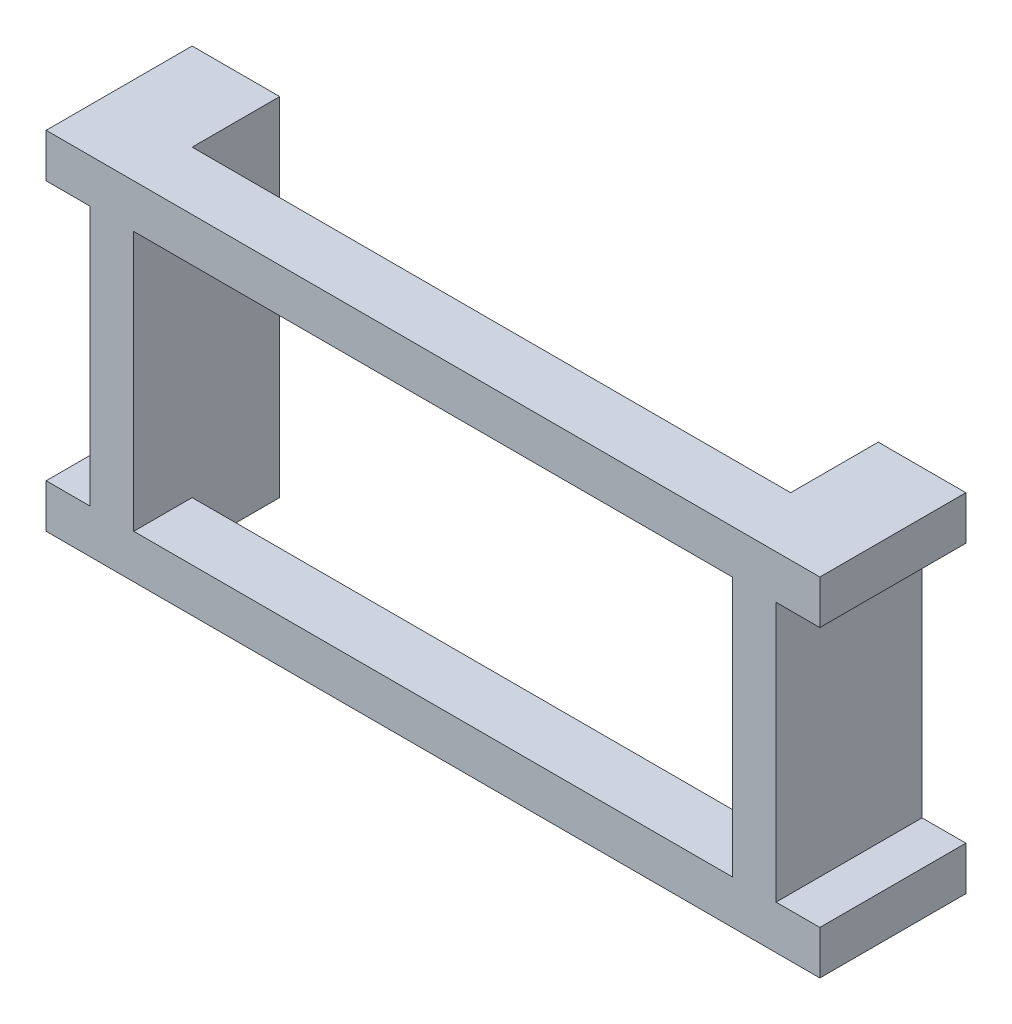
ISO-10303-21;
HEADER;
FILE_DESCRIPTION(('STEP AP214'),'2;1');
FILE_NAME('part.step','',(''),(''),'','','');
FILE_SCHEMA(('AUTOMOTIVE_DESIGN { 1 0 10303 214 1 1 1 1 }'));
ENDSEC;
DATA;
#1=APPLICATION_CONTEXT('core data for automotive mechanical design processes');
#2=APPLICATION_PROTOCOL_DEFINITION('international standard','automotive_design',2000,#1);
#3=PRODUCT_CONTEXT('',#1,'mechanical');
#4=PRODUCT('Part','Part','',(#3));
#5=PRODUCT_RELATED_PRODUCT_CATEGORY('part','',(#4));
#6=PRODUCT_DEFINITION_FORMATION('','',#4);
#7=PRODUCT_DEFINITION_CONTEXT('part definition',#1,'design');
#8=PRODUCT_DEFINITION('design','',#6,#7);
#9=PRODUCT_DEFINITION_SHAPE('','',#8);
#10=(LENGTH_UNIT() NAMED_UNIT(*) SI_UNIT(.MILLI.,.METRE.));
#11=(NAMED_UNIT(*) PLANE_ANGLE_UNIT() SI_UNIT($,.RADIAN.));
#12=(NAMED_UNIT(*) SI_UNIT($,.STERADIAN.) SOLID_ANGLE_UNIT());
#13=UNCERTAINTY_MEASURE_WITH_UNIT(LENGTH_MEASURE(1.E-05),#10,'distance_accuracy_value','');
#14=(GEOMETRIC_REPRESENTATION_CONTEXT(3) GLOBAL_UNCERTAINTY_ASSIGNED_CONTEXT((#13)) GLOBAL_UNIT_ASSIGNED_CONTEXT((#10,
#11,#12)) REPRESENTATION_CONTEXT('',''));
#15=CARTESIAN_POINT('',(0.,0.,0.));
#16=DIRECTION('',(0.,0.,1.));
#17=DIRECTION('',(1.,0.,0.));
#18=AXIS2_PLACEMENT_3D('',#15,#16,#17);
#19=CARTESIAN_POINT('',(-37.7183154819464,9.55195891387468,0.));
#20=DIRECTION('',(0.,0.,1.));
#21=DIRECTION('',(1.,0.,0.));
#22=AXIS2_PLACEMENT_3D('',#19,#20,#21);
#23=PLANE('',#22);
#24=DIRECTION('',(-1.,0.,0.));
#25=VECTOR('',#24,1.);
#26=CARTESIAN_POINT('',(-37.7183154819464,12.5519589138747,0.));
#27=LINE('',#26,#25);
#28=CARTESIAN_POINT('',(-31.7183154819464,12.5519589138747,0.));
#29=VERTEX_POINT('',#28);
#30=CARTESIAN_POINT('',(-37.7183154819464,12.5519589138747,0.));
#31=VERTEX_POINT('',#30);
#32=EDGE_CURVE('E286',#29,#31,#27,.T.);
#33=ORIENTED_EDGE('',*,*,#32,.F.);
#34=DIRECTION('',(0.,-1.,0.));
#35=VECTOR('',#34,1.);
#36=CARTESIAN_POINT('',(-31.7183154819464,9.55195891387468,0.));
#37=LINE('',#36,#35);
#38=CARTESIAN_POINT('',(-31.7183154819464,-11.2380410861253,0.));
#39=VERTEX_POINT('',#38);
#40=EDGE_CURVE('E178',#29,#39,#37,.T.);
#41=ORIENTED_EDGE('',*,*,#40,.T.);
#42=DIRECTION('',(1.,0.,0.));
#43=VECTOR('',#42,1.);
#44=CARTESIAN_POINT('',(-37.7183154819464,-11.2380410861253,0.));
#45=LINE('',#44,#43);
#46=CARTESIAN_POINT('',(-37.7183154819464,-11.2380410861253,0.));
#47=VERTEX_POINT('',#46);
#48=EDGE_CURVE('E273',#47,#39,#45,.T.);
#49=ORIENTED_EDGE('',*,*,#48,.F.);
#50=DIRECTION('',(0.,-1.,0.));
#51=VECTOR('',#50,1.);
#52=CARTESIAN_POINT('',(-37.7183154819464,-8.23804108612532,0.));
#53=LINE('',#52,#51);
#54=CARTESIAN_POINT('',(-37.7183154819464,-8.23804108612532,0.));
#55=VERTEX_POINT('',#54);
#56=EDGE_CURVE('E270',#55,#47,#53,.T.);
#57=ORIENTED_EDGE('',*,*,#56,.F.);
#58=DIRECTION('',(-1.,0.,0.));
#59=VECTOR('',#58,1.);
#60=CARTESIAN_POINT('',(-37.7183154819464,-8.23804108612532,0.));
#61=LINE('',#60,#59);
#62=CARTESIAN_POINT('',(-34.7183154819464,-8.23804108612532,0.));
#63=VERTEX_POINT('',#62);
#64=EDGE_CURVE('E268',#63,#55,#61,.T.);
#65=ORIENTED_EDGE('',*,*,#64,.F.);
#66=DIRECTION('',(0.,-1.,0.));
#67=VECTOR('',#66,1.);
#68=CARTESIAN_POINT('',(-34.7183154819464,9.55195891387468,0.));
#69=LINE('',#68,#67);
#70=CARTESIAN_POINT('',(-34.7183154819464,9.55195891387468,0.));
#71=VERTEX_POINT('',#70);
#72=EDGE_CURVE('E266',#71,#63,#69,.T.);
#73=ORIENTED_EDGE('',*,*,#72,.F.);
#74=DIRECTION('',(1.,0.,0.));
#75=VECTOR('',#74,1.);
#76=CARTESIAN_POINT('',(-37.7183154819464,9.55195891387468,0.));
#77=LINE('',#76,#75);
#78=CARTESIAN_POINT('',(-37.7183154819464,9.55195891387468,0.));
#79=VERTEX_POINT('',#78);
#80=EDGE_CURVE('E264',#79,#71,#77,.T.);
#81=ORIENTED_EDGE('',*,*,#80,.F.);
#82=DIRECTION('',(0.,-1.,0.));
#83=VECTOR('',#82,1.);
#84=CARTESIAN_POINT('',(-37.7183154819464,12.5519589138747,0.));
#85=LINE('',#84,#83);
#86=EDGE_CURVE('E234',#31,#79,#85,.T.);
#87=ORIENTED_EDGE('',*,*,#86,.F.);
#88=EDGE_LOOP('',(#33,#41,#49,#57,#65,#73,#81,#87));
#89=FACE_BOUND('',#88,.T.);
#90=ADVANCED_FACE('F33',(#89),#23,.F.);
#91=DIRECTION('',(0.,1.,0.));
#92=VECTOR('',#91,1.);
#93=CARTESIAN_POINT('',(9.28168451805363,9.55195891387468,0.));
#94=LINE('',#93,#92);
#95=CARTESIAN_POINT('',(9.28168451805363,-11.2380410861253,0.));
#96=VERTEX_POINT('',#95);
#97=CARTESIAN_POINT('',(9.28168451805363,12.5519589138747,0.));
#98=VERTEX_POINT('',#97);
#99=EDGE_CURVE('E217',#96,#98,#94,.T.);
#100=ORIENTED_EDGE('',*,*,#99,.T.);
#101=CARTESIAN_POINT('',(15.2816845180536,12.5519589138747,0.));
#102=VERTEX_POINT('',#101);
#103=EDGE_CURVE('E239',#102,#98,#27,.T.);
#104=ORIENTED_EDGE('',*,*,#103,.F.);
#105=DIRECTION('',(0.,1.,0.));
#106=VECTOR('',#105,1.);
#107=CARTESIAN_POINT('',(15.2816845180536,9.55195891387468,0.));
#108=LINE('',#107,#106);
#109=CARTESIAN_POINT('',(15.2816845180536,9.55195891387468,0.));
#110=VERTEX_POINT('',#109);
#111=EDGE_CURVE('E284',#110,#102,#108,.T.);
#112=ORIENTED_EDGE('',*,*,#111,.F.);
#113=DIRECTION('',(1.,0.,0.));
#114=VECTOR('',#113,1.);
#115=CARTESIAN_POINT('',(12.2816845180536,9.55195891387468,0.));
#116=LINE('',#115,#114);
#117=CARTESIAN_POINT('',(12.2816845180536,9.55195891387468,0.));
#118=VERTEX_POINT('',#117);
#119=EDGE_CURVE('E282',#118,#110,#116,.T.);
#120=ORIENTED_EDGE('',*,*,#119,.F.);
#121=DIRECTION('',(0.,1.,0.));
#122=VECTOR('',#121,1.);
#123=CARTESIAN_POINT('',(12.2816845180536,9.55195891387468,0.));
#124=LINE('',#123,#122);
#125=CARTESIAN_POINT('',(12.2816845180536,-8.23804108612532,0.));
#126=VERTEX_POINT('',#125);
#127=EDGE_CURVE('E280',#126,#118,#124,.T.);
#128=ORIENTED_EDGE('',*,*,#127,.F.);
#129=DIRECTION('',(-1.,0.,0.));
#130=VECTOR('',#129,1.);
#131=CARTESIAN_POINT('',(15.2816845180536,-8.23804108612532,0.));
#132=LINE('',#131,#130);
#133=CARTESIAN_POINT('',(15.2816845180536,-8.23804108612532,0.));
#134=VERTEX_POINT('',#133);
#135=EDGE_CURVE('E278',#134,#126,#132,.T.);
#136=ORIENTED_EDGE('',*,*,#135,.F.);
#137=DIRECTION('',(0.,1.,0.));
#138=VECTOR('',#137,1.);
#139=CARTESIAN_POINT('',(15.2816845180536,-8.23804108612532,0.));
#140=LINE('',#139,#138);
#141=CARTESIAN_POINT('',(15.2816845180536,-11.2380410861253,0.));
#142=VERTEX_POINT('',#141);
#143=EDGE_CURVE('E276',#142,#134,#140,.T.);
#144=ORIENTED_EDGE('',*,*,#143,.F.);
#145=EDGE_CURVE('E272',#96,#142,#45,.T.);
#146=ORIENTED_EDGE('',*,*,#145,.F.);
#147=EDGE_LOOP('',(#100,#104,#112,#120,#128,#136,#144,#146));
#148=FACE_BOUND('',#147,.T.);
#149=ADVANCED_FACE('F358',(#148),#23,.F.);
#150=CARTESIAN_POINT('',(-37.7183154819464,12.5519589138747,10.));
#151=DIRECTION('',(0.,-1.,0.));
#152=DIRECTION('',(0.,0.,-1.));
#153=AXIS2_PLACEMENT_3D('',#150,#151,#152);
#154=PLANE('',#153);
#155=DIRECTION('',(0.,0.,-1.));
#156=VECTOR('',#155,1.);
#157=CARTESIAN_POINT('',(-31.7183154819464,12.5519589138747,6.));
#158=LINE('',#157,#156);
#159=CARTESIAN_POINT('',(-31.7183154819464,12.5519589138747,6.));
#160=VERTEX_POINT('',#159);
#161=EDGE_CURVE('E171',#160,#29,#158,.T.);
#162=ORIENTED_EDGE('',*,*,#161,.T.);
#163=ORIENTED_EDGE('',*,*,#32,.T.);
#164=DIRECTION('',(0.,0.,-1.));
#165=VECTOR('',#164,1.);
#166=CARTESIAN_POINT('',(-37.7183154819464,12.5519589138747,10.));
#167=LINE('',#166,#165);
#168=CARTESIAN_POINT('',(-37.7183154819464,12.5519589138747,10.));
#169=VERTEX_POINT('',#168);
#170=EDGE_CURVE('E261',#169,#31,#167,.T.);
#171=ORIENTED_EDGE('',*,*,#170,.F.);
#172=DIRECTION('',(-1.,0.,0.));
#173=VECTOR('',#172,1.);
#174=CARTESIAN_POINT('',(-37.7183154819464,12.5519589138747,10.));
#175=LINE('',#174,#173);
#176=CARTESIAN_POINT('',(15.2816845180536,12.5519589138747,10.));
#177=VERTEX_POINT('',#176);
#178=EDGE_CURVE('E259',#177,#169,#175,.T.);
#179=ORIENTED_EDGE('',*,*,#178,.F.);
#180=DIRECTION('',(0.,0.,-1.));
#181=VECTOR('',#180,1.);
#182=CARTESIAN_POINT('',(15.2816845180536,12.5519589138747,10.));
#183=LINE('',#182,#181);
#184=EDGE_CURVE('E290',#177,#102,#183,.T.);
#185=ORIENTED_EDGE('',*,*,#184,.T.);
#186=ORIENTED_EDGE('',*,*,#103,.T.);
#187=DIRECTION('',(0.,0.,-1.));
#188=VECTOR('',#187,1.);
#189=CARTESIAN_POINT('',(9.28168451805363,12.5519589138747,6.));
#190=LINE('',#189,#188);
#191=CARTESIAN_POINT('',(9.28168451805363,12.5519589138747,6.));
#192=VERTEX_POINT('',#191);
#193=EDGE_CURVE('E182',#192,#98,#190,.T.);
#194=ORIENTED_EDGE('',*,*,#193,.F.);
#195=DIRECTION('',(-1.,0.,0.));
#196=VECTOR('',#195,1.);
#197=CARTESIAN_POINT('',(-31.7183154819464,12.5519589138747,6.));
#198=LINE('',#197,#196);
#199=EDGE_CURVE('E188',#192,#160,#198,.T.);
#200=ORIENTED_EDGE('',*,*,#199,.T.);
#201=EDGE_LOOP('',(#162,#163,#171,#179,#185,#186,#194,#200));
#202=FACE_BOUND('',#201,.T.);
#203=ADVANCED_FACE('F192',(#202),#154,.F.);
#204=CARTESIAN_POINT('',(-37.7183154819464,9.55195891387468,10.));
#205=DIRECTION('',(0.,0.,1.));
#206=DIRECTION('',(1.,0.,0.));
#207=AXIS2_PLACEMENT_3D('',#204,#205,#206);
#208=PLANE('',#207);
#209=DIRECTION('',(0.,-1.,0.));
#210=VECTOR('',#209,1.);
#211=CARTESIAN_POINT('',(-37.7183154819464,12.5519589138747,10.));
#212=LINE('',#211,#210);
#213=CARTESIAN_POINT('',(-37.7183154819464,9.55195891387468,10.));
#214=VERTEX_POINT('',#213);
#215=EDGE_CURVE('E235',#169,#214,#212,.T.);
#216=ORIENTED_EDGE('',*,*,#215,.T.);
#217=DIRECTION('',(1.,0.,0.));
#218=VECTOR('',#217,1.);
#219=CARTESIAN_POINT('',(-37.7183154819464,9.55195891387468,10.));
#220=LINE('',#219,#218);
#221=CARTESIAN_POINT('',(-34.7183154819464,9.55195891387468,10.));
#222=VERTEX_POINT('',#221);
#223=EDGE_CURVE('E238',#214,#222,#220,.T.);
#224=ORIENTED_EDGE('',*,*,#223,.T.);
#225=DIRECTION('',(0.,-1.,0.));
#226=VECTOR('',#225,1.);
#227=CARTESIAN_POINT('',(-34.7183154819464,9.55195891387468,10.));
#228=LINE('',#227,#226);
#229=CARTESIAN_POINT('',(-34.7183154819464,-8.23804108612532,10.));
#230=VERTEX_POINT('',#229);
#231=EDGE_CURVE('E241',#222,#230,#228,.T.);
#232=ORIENTED_EDGE('',*,*,#231,.T.);
#233=DIRECTION('',(-1.,0.,0.));
#234=VECTOR('',#233,1.);
#235=CARTESIAN_POINT('',(-37.7183154819464,-8.23804108612532,10.));
#236=LINE('',#235,#234);
#237=CARTESIAN_POINT('',(-37.7183154819464,-8.23804108612532,10.));
#238=VERTEX_POINT('',#237);
#239=EDGE_CURVE('E243',#230,#238,#236,.T.);
#240=ORIENTED_EDGE('',*,*,#239,.T.);
#241=DIRECTION('',(0.,-1.,0.));
#242=VECTOR('',#241,1.);
#243=CARTESIAN_POINT('',(-37.7183154819464,-8.23804108612532,10.));
#244=LINE('',#243,#242);
#245=CARTESIAN_POINT('',(-37.7183154819464,-11.2380410861253,10.));
#246=VERTEX_POINT('',#245);
#247=EDGE_CURVE('E245',#238,#246,#244,.T.);
#248=ORIENTED_EDGE('',*,*,#247,.T.);
#249=DIRECTION('',(1.,0.,0.));
#250=VECTOR('',#249,1.);
#251=CARTESIAN_POINT('',(-37.7183154819464,-11.2380410861253,10.));
#252=LINE('',#251,#250);
#253=CARTESIAN_POINT('',(15.2816845180536,-11.2380410861253,10.));
#254=VERTEX_POINT('',#253);
#255=EDGE_CURVE('E247',#246,#254,#252,.T.);
#256=ORIENTED_EDGE('',*,*,#255,.T.);
#257=DIRECTION('',(0.,1.,0.));
#258=VECTOR('',#257,1.);
#259=CARTESIAN_POINT('',(15.2816845180536,-8.23804108612532,10.));
#260=LINE('',#259,#258);
#261=CARTESIAN_POINT('',(15.2816845180536,-8.23804108612532,10.));
#262=VERTEX_POINT('',#261);
#263=EDGE_CURVE('E249',#254,#262,#260,.T.);
#264=ORIENTED_EDGE('',*,*,#263,.T.);
#265=DIRECTION('',(-1.,0.,0.));
#266=VECTOR('',#265,1.);
#267=CARTESIAN_POINT('',(15.2816845180536,-8.23804108612532,10.));
#268=LINE('',#267,#266);
#269=CARTESIAN_POINT('',(12.2816845180536,-8.23804108612532,10.));
#270=VERTEX_POINT('',#269);
#271=EDGE_CURVE('E251',#262,#270,#268,.T.);
#272=ORIENTED_EDGE('',*,*,#271,.T.);
#273=DIRECTION('',(0.,1.,0.));
#274=VECTOR('',#273,1.);
#275=CARTESIAN_POINT('',(12.2816845180536,9.55195891387468,10.));
#276=LINE('',#275,#274);
#277=CARTESIAN_POINT('',(12.2816845180536,9.55195891387468,10.));
#278=VERTEX_POINT('',#277);
#279=EDGE_CURVE('E253',#270,#278,#276,.T.);
#280=ORIENTED_EDGE('',*,*,#279,.T.);
#281=DIRECTION('',(1.,0.,0.));
#282=VECTOR('',#281,1.);
#283=CARTESIAN_POINT('',(12.2816845180536,9.55195891387468,10.));
#284=LINE('',#283,#282);
#285=CARTESIAN_POINT('',(15.2816845180536,9.55195891387468,10.));
#286=VERTEX_POINT('',#285);
#287=EDGE_CURVE('E255',#278,#286,#284,.T.);
#288=ORIENTED_EDGE('',*,*,#287,.T.);
#289=DIRECTION('',(0.,1.,0.));
#290=VECTOR('',#289,1.);
#291=CARTESIAN_POINT('',(15.2816845180536,9.55195891387468,10.));
#292=LINE('',#291,#290);
#293=EDGE_CURVE('E257',#286,#177,#292,.T.);
#294=ORIENTED_EDGE('',*,*,#293,.T.);
#295=ORIENTED_EDGE('',*,*,#178,.T.);
#296=EDGE_LOOP('',(#216,#224,#232,#240,#248,#256,#264,#272,#280,#288,#294,#295));
#297=FACE_BOUND('',#296,.T.);
#298=DIRECTION('',(0.,-1.,0.));
#299=VECTOR('',#298,1.);
#300=CARTESIAN_POINT('',(-31.7183154819464,9.55195891387468,10.));
#301=LINE('',#300,#299);
#302=CARTESIAN_POINT('',(-31.7183154819464,9.55195891387468,10.));
#303=VERTEX_POINT('',#302);
#304=CARTESIAN_POINT('',(-31.7183154819464,-8.23804108612532,10.));
#305=VERTEX_POINT('',#304);
#306=EDGE_CURVE('E216',#303,#305,#301,.T.);
#307=ORIENTED_EDGE('',*,*,#306,.F.);
#308=DIRECTION('',(-1.,0.,0.));
#309=VECTOR('',#308,1.);
#310=CARTESIAN_POINT('',(-31.7183154819464,9.55195891387468,10.));
#311=LINE('',#310,#309);
#312=CARTESIAN_POINT('',(9.28168451805363,9.55195891387468,10.));
#313=VERTEX_POINT('',#312);
#314=EDGE_CURVE('E214',#313,#303,#311,.T.);
#315=ORIENTED_EDGE('',*,*,#314,.F.);
#316=DIRECTION('',(0.,1.,0.));
#317=VECTOR('',#316,1.);
#318=CARTESIAN_POINT('',(9.28168451805363,9.55195891387468,10.));
#319=LINE('',#318,#317);
#320=CARTESIAN_POINT('',(9.28168451805363,-8.23804108612532,10.));
#321=VERTEX_POINT('',#320);
#322=EDGE_CURVE('E221',#321,#313,#319,.T.);
#323=ORIENTED_EDGE('',*,*,#322,.F.);
#324=DIRECTION('',(1.,0.,0.));
#325=VECTOR('',#324,1.);
#326=CARTESIAN_POINT('',(-31.7183154819464,-8.23804108612532,10.));
#327=LINE('',#326,#325);
#328=EDGE_CURVE('E219',#305,#321,#327,.T.);
#329=ORIENTED_EDGE('',*,*,#328,.F.);
#330=EDGE_LOOP('',(#307,#315,#323,#329));
#331=FACE_BOUND('',#330,.T.);
#332=ADVANCED_FACE('F339',(#297,#331),#208,.T.);
#333=CARTESIAN_POINT('',(-37.7183154819464,12.5519589138747,10.));
#334=DIRECTION('',(1.,0.,0.));
#335=DIRECTION('',(0.,0.,-1.));
#336=AXIS2_PLACEMENT_3D('',#333,#334,#335);
#337=PLANE('',#336);
#338=ORIENTED_EDGE('',*,*,#86,.T.);
#339=DIRECTION('',(0.,0.,-1.));
#340=VECTOR('',#339,1.);
#341=CARTESIAN_POINT('',(-37.7183154819464,9.55195891387468,10.));
#342=LINE('',#341,#340);
#343=EDGE_CURVE('E11',#214,#79,#342,.T.);
#344=ORIENTED_EDGE('',*,*,#343,.F.);
#345=ORIENTED_EDGE('',*,*,#215,.F.);
#346=ORIENTED_EDGE('',*,*,#170,.T.);
#347=EDGE_LOOP('',(#338,#344,#345,#346));
#348=FACE_BOUND('',#347,.T.);
#349=ADVANCED_FACE('F35',(#348),#337,.F.);
#350=CARTESIAN_POINT('',(-37.7183154819464,9.55195891387468,10.));
#351=DIRECTION('',(0.,1.,0.));
#352=DIRECTION('',(0.,0.,1.));
#353=AXIS2_PLACEMENT_3D('',#350,#351,#352);
#354=PLANE('',#353);
#355=ORIENTED_EDGE('',*,*,#80,.T.);
#356=DIRECTION('',(0.,0.,-1.));
#357=VECTOR('',#356,1.);
#358=CARTESIAN_POINT('',(-34.7183154819464,9.55195891387468,10.));
#359=LINE('',#358,#357);
#360=EDGE_CURVE('E41',#222,#71,#359,.T.);
#361=ORIENTED_EDGE('',*,*,#360,.F.);
#362=ORIENTED_EDGE('',*,*,#223,.F.);
#363=ORIENTED_EDGE('',*,*,#343,.T.);
#364=EDGE_LOOP('',(#355,#361,#362,#363));
#365=FACE_BOUND('',#364,.T.);
#366=ADVANCED_FACE('F344',(#365),#354,.F.);
#367=CARTESIAN_POINT('',(-34.7183154819464,9.55195891387468,10.));
#368=DIRECTION('',(1.,0.,0.));
#369=DIRECTION('',(0.,0.,-1.));
#370=AXIS2_PLACEMENT_3D('',#367,#368,#369);
#371=PLANE('',#370);
#372=ORIENTED_EDGE('',*,*,#72,.T.);
#373=DIRECTION('',(0.,0.,-1.));
#374=VECTOR('',#373,1.);
#375=CARTESIAN_POINT('',(-34.7183154819464,-8.23804108612532,10.));
#376=LINE('',#375,#374);
#377=EDGE_CURVE('E314',#230,#63,#376,.T.);
#378=ORIENTED_EDGE('',*,*,#377,.F.);
#379=ORIENTED_EDGE('',*,*,#231,.F.);
#380=ORIENTED_EDGE('',*,*,#360,.T.);
#381=EDGE_LOOP('',(#372,#378,#379,#380));
#382=FACE_BOUND('',#381,.T.);
#383=ADVANCED_FACE('F321',(#382),#371,.F.);
#384=CARTESIAN_POINT('',(-37.7183154819464,-8.23804108612532,10.));
#385=DIRECTION('',(0.,-1.,0.));
#386=DIRECTION('',(0.,0.,-1.));
#387=AXIS2_PLACEMENT_3D('',#384,#385,#386);
#388=PLANE('',#387);
#389=ORIENTED_EDGE('',*,*,#64,.T.);
#390=DIRECTION('',(0.,0.,-1.));
#391=VECTOR('',#390,1.);
#392=CARTESIAN_POINT('',(-37.7183154819464,-8.23804108612532,10.));
#393=LINE('',#392,#391);
#394=EDGE_CURVE('E311',#238,#55,#393,.T.);
#395=ORIENTED_EDGE('',*,*,#394,.F.);
#396=ORIENTED_EDGE('',*,*,#239,.F.);
#397=ORIENTED_EDGE('',*,*,#377,.T.);
#398=EDGE_LOOP('',(#389,#395,#396,#397));
#399=FACE_BOUND('',#398,.T.);
#400=ADVANCED_FACE('F331',(#399),#388,.F.);
#401=CARTESIAN_POINT('',(-37.7183154819464,-8.23804108612532,10.));
#402=DIRECTION('',(1.,0.,0.));
#403=DIRECTION('',(0.,0.,-1.));
#404=AXIS2_PLACEMENT_3D('',#401,#402,#403);
#405=PLANE('',#404);
#406=ORIENTED_EDGE('',*,*,#56,.T.);
#407=DIRECTION('',(0.,0.,-1.));
#408=VECTOR('',#407,1.);
#409=CARTESIAN_POINT('',(-37.7183154819464,-11.2380410861253,10.));
#410=LINE('',#409,#408);
#411=EDGE_CURVE('E308',#246,#47,#410,.T.);
#412=ORIENTED_EDGE('',*,*,#411,.F.);
#413=ORIENTED_EDGE('',*,*,#247,.F.);
#414=ORIENTED_EDGE('',*,*,#394,.T.);
#415=EDGE_LOOP('',(#406,#412,#413,#414));
#416=FACE_BOUND('',#415,.T.);
#417=ADVANCED_FACE('F335',(#416),#405,.F.);
#418=CARTESIAN_POINT('',(-37.7183154819464,-11.2380410861253,10.));
#419=DIRECTION('',(0.,1.,0.));
#420=DIRECTION('',(0.,0.,1.));
#421=AXIS2_PLACEMENT_3D('',#418,#419,#420);
#422=PLANE('',#421);
#423=ORIENTED_EDGE('',*,*,#48,.T.);
#424=DIRECTION('',(0.,0.,-1.));
#425=VECTOR('',#424,1.);
#426=CARTESIAN_POINT('',(-31.7183154819464,-11.2380410861253,6.));
#427=LINE('',#426,#425);
#428=CARTESIAN_POINT('',(-31.7183154819464,-11.2380410861253,6.));
#429=VERTEX_POINT('',#428);
#430=EDGE_CURVE('E210',#429,#39,#427,.T.);
#431=ORIENTED_EDGE('',*,*,#430,.F.);
#432=DIRECTION('',(-1.,0.,0.));
#433=VECTOR('',#432,1.);
#434=CARTESIAN_POINT('',(-31.7183154819464,-11.2380410861253,6.));
#435=LINE('',#434,#433);
#436=CARTESIAN_POINT('',(9.28168451805363,-11.2380410861253,6.));
#437=VERTEX_POINT('',#436);
#438=EDGE_CURVE('E206',#437,#429,#435,.T.);
#439=ORIENTED_EDGE('',*,*,#438,.F.);
#440=DIRECTION('',(0.,0.,-1.));
#441=VECTOR('',#440,1.);
#442=CARTESIAN_POINT('',(9.28168451805363,-11.2380410861253,6.));
#443=LINE('',#442,#441);
#444=EDGE_CURVE('E209',#437,#96,#443,.T.);
#445=ORIENTED_EDGE('',*,*,#444,.T.);
#446=ORIENTED_EDGE('',*,*,#145,.T.);
#447=DIRECTION('',(0.,0.,-1.));
#448=VECTOR('',#447,1.);
#449=CARTESIAN_POINT('',(15.2816845180536,-11.2380410861253,10.));
#450=LINE('',#449,#448);
#451=EDGE_CURVE('E305',#254,#142,#450,.T.);
#452=ORIENTED_EDGE('',*,*,#451,.F.);
#453=ORIENTED_EDGE('',*,*,#255,.F.);
#454=ORIENTED_EDGE('',*,*,#411,.T.);
#455=EDGE_LOOP('',(#423,#431,#439,#445,#446,#452,#453,#454));
#456=FACE_BOUND('',#455,.T.);
#457=ADVANCED_FACE('F377',(#456),#422,.F.);
#458=CARTESIAN_POINT('',(15.2816845180536,-8.23804108612532,10.));
#459=DIRECTION('',(-1.,0.,0.));
#460=DIRECTION('',(0.,-1.,0.));
#461=AXIS2_PLACEMENT_3D('',#458,#459,#460);
#462=PLANE('',#461);
#463=ORIENTED_EDGE('',*,*,#143,.T.);
#464=DIRECTION('',(0.,0.,-1.));
#465=VECTOR('',#464,1.);
#466=CARTESIAN_POINT('',(15.2816845180536,-8.23804108612532,10.));
#467=LINE('',#466,#465);
#468=EDGE_CURVE('E302',#262,#134,#467,.T.);
#469=ORIENTED_EDGE('',*,*,#468,.F.);
#470=ORIENTED_EDGE('',*,*,#263,.F.);
#471=ORIENTED_EDGE('',*,*,#451,.T.);
#472=EDGE_LOOP('',(#463,#469,#470,#471));
#473=FACE_BOUND('',#472,.T.);
#474=ADVANCED_FACE('F381',(#473),#462,.F.);
#475=CARTESIAN_POINT('',(15.2816845180536,-8.23804108612532,10.));
#476=DIRECTION('',(0.,-1.,0.));
#477=DIRECTION('',(0.,0.,-1.));
#478=AXIS2_PLACEMENT_3D('',#475,#476,#477);
#479=PLANE('',#478);
#480=ORIENTED_EDGE('',*,*,#135,.T.);
#481=DIRECTION('',(0.,0.,-1.));
#482=VECTOR('',#481,1.);
#483=CARTESIAN_POINT('',(12.2816845180536,-8.23804108612532,10.));
#484=LINE('',#483,#482);
#485=EDGE_CURVE('E299',#270,#126,#484,.T.);
#486=ORIENTED_EDGE('',*,*,#485,.F.);
#487=ORIENTED_EDGE('',*,*,#271,.F.);
#488=ORIENTED_EDGE('',*,*,#468,.T.);
#489=EDGE_LOOP('',(#480,#486,#487,#488));
#490=FACE_BOUND('',#489,.T.);
#491=ADVANCED_FACE('F387',(#490),#479,.F.);
#492=CARTESIAN_POINT('',(12.2816845180536,9.55195891387468,10.));
#493=DIRECTION('',(-1.,0.,0.));
#494=DIRECTION('',(0.,-1.,0.));
#495=AXIS2_PLACEMENT_3D('',#492,#493,#494);
#496=PLANE('',#495);
#497=ORIENTED_EDGE('',*,*,#127,.T.);
#498=DIRECTION('',(0.,0.,-1.));
#499=VECTOR('',#498,1.);
#500=CARTESIAN_POINT('',(12.2816845180536,9.55195891387468,10.));
#501=LINE('',#500,#499);
#502=EDGE_CURVE('E296',#278,#118,#501,.T.);
#503=ORIENTED_EDGE('',*,*,#502,.F.);
#504=ORIENTED_EDGE('',*,*,#279,.F.);
#505=ORIENTED_EDGE('',*,*,#485,.T.);
#506=EDGE_LOOP('',(#497,#503,#504,#505));
#507=FACE_BOUND('',#506,.T.);
#508=ADVANCED_FACE('F390',(#507),#496,.F.);
#509=CARTESIAN_POINT('',(12.2816845180536,9.55195891387468,10.));
#510=DIRECTION('',(0.,1.,0.));
#511=DIRECTION('',(-1.,0.,0.));
#512=AXIS2_PLACEMENT_3D('',#509,#510,#511);
#513=PLANE('',#512);
#514=ORIENTED_EDGE('',*,*,#119,.T.);
#515=DIRECTION('',(0.,0.,-1.));
#516=VECTOR('',#515,1.);
#517=CARTESIAN_POINT('',(15.2816845180536,9.55195891387468,10.));
#518=LINE('',#517,#516);
#519=EDGE_CURVE('E293',#286,#110,#518,.T.);
#520=ORIENTED_EDGE('',*,*,#519,.F.);
#521=ORIENTED_EDGE('',*,*,#287,.F.);
#522=ORIENTED_EDGE('',*,*,#502,.T.);
#523=EDGE_LOOP('',(#514,#520,#521,#522));
#524=FACE_BOUND('',#523,.T.);
#525=ADVANCED_FACE('F392',(#524),#513,.F.);
#526=CARTESIAN_POINT('',(15.2816845180536,9.55195891387468,10.));
#527=DIRECTION('',(-1.,0.,0.));
#528=DIRECTION('',(0.,-1.,0.));
#529=AXIS2_PLACEMENT_3D('',#526,#527,#528);
#530=PLANE('',#529);
#531=ORIENTED_EDGE('',*,*,#111,.T.);
#532=ORIENTED_EDGE('',*,*,#184,.F.);
#533=ORIENTED_EDGE('',*,*,#293,.F.);
#534=ORIENTED_EDGE('',*,*,#519,.T.);
#535=EDGE_LOOP('',(#531,#532,#533,#534));
#536=FACE_BOUND('',#535,.T.);
#537=ADVANCED_FACE('F354',(#536),#530,.F.);
#538=CARTESIAN_POINT('',(-31.7183154819464,9.55195891387468,10.));
#539=DIRECTION('',(0.,-1.,0.));
#540=DIRECTION('',(0.,0.,-1.));
#541=AXIS2_PLACEMENT_3D('',#538,#539,#540);
#542=PLANE('',#541);
#543=DIRECTION('',(1.,0.,0.));
#544=VECTOR('',#543,1.);
#545=CARTESIAN_POINT('',(-31.7183154819464,9.55195891387468,6.));
#546=LINE('',#545,#544);
#547=CARTESIAN_POINT('',(-31.7183154819464,9.55195891387468,6.));
#548=VERTEX_POINT('',#547);
#549=CARTESIAN_POINT('',(9.28168451805363,9.55195891387468,6.));
#550=VERTEX_POINT('',#549);
#551=EDGE_CURVE('E183',#548,#550,#546,.T.);
#552=ORIENTED_EDGE('',*,*,#551,.T.);
#553=DIRECTION('',(0.,0.,-1.));
#554=VECTOR('',#553,1.);
#555=CARTESIAN_POINT('',(9.28168451805363,9.55195891387468,10.));
#556=LINE('',#555,#554);
#557=EDGE_CURVE('E223',#313,#550,#556,.T.);
#558=ORIENTED_EDGE('',*,*,#557,.F.);
#559=ORIENTED_EDGE('',*,*,#314,.T.);
#560=DIRECTION('',(0.,0.,-1.));
#561=VECTOR('',#560,1.);
#562=CARTESIAN_POINT('',(-31.7183154819464,9.55195891387468,10.));
#563=LINE('',#562,#561);
#564=EDGE_CURVE('E232',#303,#548,#563,.T.);
#565=ORIENTED_EDGE('',*,*,#564,.T.);
#566=EDGE_LOOP('',(#552,#558,#559,#565));
#567=FACE_BOUND('',#566,.T.);
#568=ADVANCED_FACE('F365',(#567),#542,.T.);
#569=CARTESIAN_POINT('',(-31.7183154819464,9.55195891387468,10.));
#570=DIRECTION('',(1.,0.,0.));
#571=DIRECTION('',(0.,0.,-1.));
#572=AXIS2_PLACEMENT_3D('',#569,#570,#571);
#573=PLANE('',#572);
#574=ORIENTED_EDGE('',*,*,#40,.F.);
#575=ORIENTED_EDGE('',*,*,#161,.F.);
#576=DIRECTION('',(0.,-1.,0.));
#577=VECTOR('',#576,1.);
#578=CARTESIAN_POINT('',(-31.7183154819464,9.55195891387468,6.));
#579=LINE('',#578,#577);
#580=EDGE_CURVE('E175',#160,#548,#579,.T.);
#581=ORIENTED_EDGE('',*,*,#580,.T.);
#582=ORIENTED_EDGE('',*,*,#564,.F.);
#583=ORIENTED_EDGE('',*,*,#306,.T.);
#584=DIRECTION('',(0.,0.,-1.));
#585=VECTOR('',#584,1.);
#586=CARTESIAN_POINT('',(-31.7183154819464,-8.23804108612532,10.));
#587=LINE('',#586,#585);
#588=CARTESIAN_POINT('',(-31.7183154819464,-8.23804108612532,6.));
#589=VERTEX_POINT('',#588);
#590=EDGE_CURVE('E229',#305,#589,#587,.T.);
#591=ORIENTED_EDGE('',*,*,#590,.T.);
#592=DIRECTION('',(0.,1.,0.));
#593=VECTOR('',#592,1.);
#594=CARTESIAN_POINT('',(-31.7183154819464,-8.23804108612532,6.));
#595=LINE('',#594,#593);
#596=EDGE_CURVE('E200',#429,#589,#595,.T.);
#597=ORIENTED_EDGE('',*,*,#596,.F.);
#598=ORIENTED_EDGE('',*,*,#430,.T.);
#599=EDGE_LOOP('',(#574,#575,#581,#582,#583,#591,#597,#598));
#600=FACE_BOUND('',#599,.T.);
#601=ADVANCED_FACE('F173',(#600),#573,.T.);
#602=CARTESIAN_POINT('',(-31.7183154819464,-8.23804108612532,10.));
#603=DIRECTION('',(0.,1.,0.));
#604=DIRECTION('',(0.,0.,1.));
#605=AXIS2_PLACEMENT_3D('',#602,#603,#604);
#606=PLANE('',#605);
#607=DIRECTION('',(1.,0.,0.));
#608=VECTOR('',#607,1.);
#609=CARTESIAN_POINT('',(-31.7183154819464,-8.23804108612532,6.));
#610=LINE('',#609,#608);
#611=CARTESIAN_POINT('',(9.28168451805363,-8.23804108612532,6.));
#612=VERTEX_POINT('',#611);
#613=EDGE_CURVE('E48',#589,#612,#610,.T.);
#614=ORIENTED_EDGE('',*,*,#613,.F.);
#615=ORIENTED_EDGE('',*,*,#590,.F.);
#616=ORIENTED_EDGE('',*,*,#328,.T.);
#617=DIRECTION('',(0.,0.,-1.));
#618=VECTOR('',#617,1.);
#619=CARTESIAN_POINT('',(9.28168451805363,-8.23804108612532,10.));
#620=LINE('',#619,#618);
#621=EDGE_CURVE('E55',#321,#612,#620,.T.);
#622=ORIENTED_EDGE('',*,*,#621,.T.);
#623=EDGE_LOOP('',(#614,#615,#616,#622));
#624=FACE_BOUND('',#623,.T.);
#625=ADVANCED_FACE('F372',(#624),#606,.T.);
#626=CARTESIAN_POINT('',(9.28168451805363,9.55195891387468,10.));
#627=DIRECTION('',(-1.,0.,0.));
#628=DIRECTION('',(0.,0.,1.));
#629=AXIS2_PLACEMENT_3D('',#626,#627,#628);
#630=PLANE('',#629);
#631=ORIENTED_EDGE('',*,*,#99,.F.);
#632=ORIENTED_EDGE('',*,*,#444,.F.);
#633=DIRECTION('',(0.,-1.,0.));
#634=VECTOR('',#633,1.);
#635=CARTESIAN_POINT('',(9.28168451805363,-8.23804108612532,6.));
#636=LINE('',#635,#634);
#637=EDGE_CURVE('E204',#612,#437,#636,.T.);
#638=ORIENTED_EDGE('',*,*,#637,.F.);
#639=ORIENTED_EDGE('',*,*,#621,.F.);
#640=ORIENTED_EDGE('',*,*,#322,.T.);
#641=ORIENTED_EDGE('',*,*,#557,.T.);
#642=DIRECTION('',(0.,1.,0.));
#643=VECTOR('',#642,1.);
#644=CARTESIAN_POINT('',(9.28168451805363,9.55195891387468,6.));
#645=LINE('',#644,#643);
#646=EDGE_CURVE('E195',#550,#192,#645,.T.);
#647=ORIENTED_EDGE('',*,*,#646,.T.);
#648=ORIENTED_EDGE('',*,*,#193,.T.);
#649=EDGE_LOOP('',(#631,#632,#638,#639,#640,#641,#647,#648));
#650=FACE_BOUND('',#649,.T.);
#651=ADVANCED_FACE('F362',(#650),#630,.T.);
#652=CARTESIAN_POINT('',(0.,0.,6.));
#653=DIRECTION('',(0.,0.,1.));
#654=DIRECTION('',(1.,0.,0.));
#655=AXIS2_PLACEMENT_3D('',#652,#653,#654);
#656=PLANE('',#655);
#657=ORIENTED_EDGE('',*,*,#596,.T.);
#658=ORIENTED_EDGE('',*,*,#613,.T.);
#659=ORIENTED_EDGE('',*,*,#637,.T.);
#660=ORIENTED_EDGE('',*,*,#438,.T.);
#661=EDGE_LOOP('',(#657,#658,#659,#660));
#662=FACE_BOUND('',#661,.T.);
#663=ADVANCED_FACE('F375',(#662),#656,.F.);
#664=CARTESIAN_POINT('',(0.,1.31391782774936,6.));
#665=DIRECTION('',(0.,0.,1.));
#666=DIRECTION('',(1.,0.,0.));
#667=AXIS2_PLACEMENT_3D('',#664,#665,#666);
#668=PLANE('',#667);
#669=ORIENTED_EDGE('',*,*,#580,.F.);
#670=ORIENTED_EDGE('',*,*,#199,.F.);
#671=ORIENTED_EDGE('',*,*,#646,.F.);
#672=ORIENTED_EDGE('',*,*,#551,.F.);
#673=EDGE_LOOP('',(#669,#670,#671,#672));
#674=FACE_BOUND('',#673,.T.);
#675=ADVANCED_FACE('F187',(#674),#668,.F.);
#676=CLOSED_SHELL('',(#90,#149,#203,#332,#349,#366,#383,#400,#417,#457,#474,#491,#508,#525,#537,
#568,#601,#625,#651,#663,#675));
#677=MANIFOLD_SOLID_BREP('B2',#676);
#678=ADVANCED_BREP_SHAPE_REPRESENTATION('',(#18,#677),#14);
#679=SHAPE_DEFINITION_REPRESENTATION(#9,#678);
ENDSEC;
END-ISO-10303-21;
